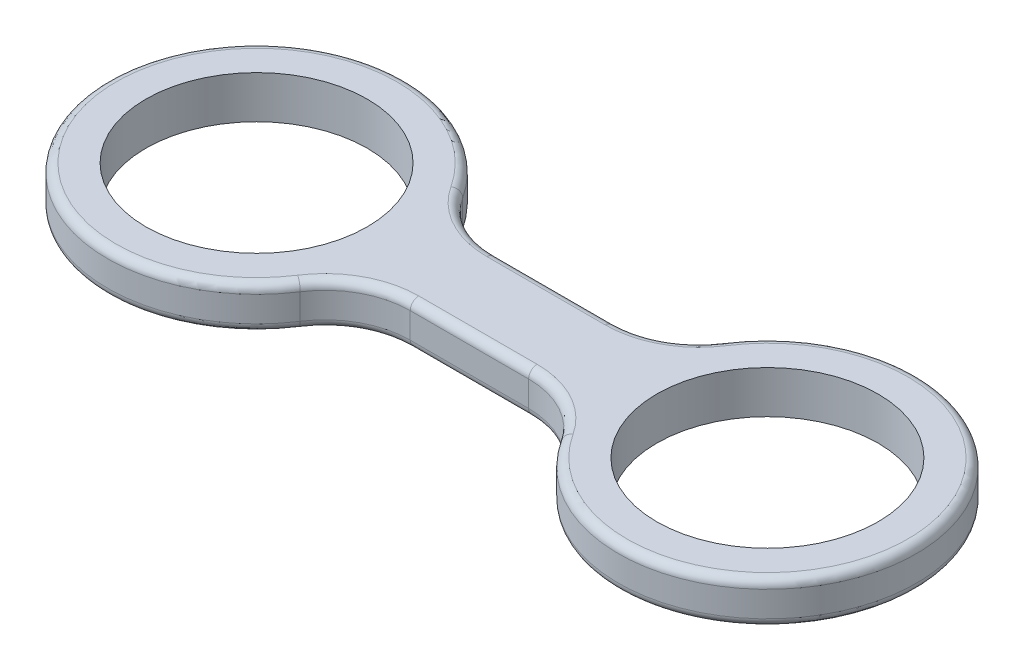
ISO-10303-21;
HEADER;
FILE_DESCRIPTION(('STEP AP214'),'2;1');
FILE_NAME('part.step','',(''),(''),'','','');
FILE_SCHEMA(('AUTOMOTIVE_DESIGN { 1 0 10303 214 1 1 1 1 }'));
ENDSEC;
DATA;
#1=APPLICATION_CONTEXT('core data for automotive mechanical design processes');
#2=APPLICATION_PROTOCOL_DEFINITION('international standard','automotive_design',2000,#1);
#3=PRODUCT_CONTEXT('',#1,'mechanical');
#4=PRODUCT('Part','Part','',(#3));
#5=PRODUCT_RELATED_PRODUCT_CATEGORY('part','',(#4));
#6=PRODUCT_DEFINITION_FORMATION('','',#4);
#7=PRODUCT_DEFINITION_CONTEXT('part definition',#1,'design');
#8=PRODUCT_DEFINITION('design','',#6,#7);
#9=PRODUCT_DEFINITION_SHAPE('','',#8);
#10=(LENGTH_UNIT() NAMED_UNIT(*) SI_UNIT(.MILLI.,.METRE.));
#11=(NAMED_UNIT(*) PLANE_ANGLE_UNIT() SI_UNIT($,.RADIAN.));
#12=(NAMED_UNIT(*) SI_UNIT($,.STERADIAN.) SOLID_ANGLE_UNIT());
#13=UNCERTAINTY_MEASURE_WITH_UNIT(LENGTH_MEASURE(1.E-05),#10,'distance_accuracy_value','');
#14=(GEOMETRIC_REPRESENTATION_CONTEXT(3) GLOBAL_UNCERTAINTY_ASSIGNED_CONTEXT((#13)) GLOBAL_UNIT_ASSIGNED_CONTEXT((#10,
#11,#12)) REPRESENTATION_CONTEXT('',''));
#15=CARTESIAN_POINT('',(0.,0.,0.));
#16=DIRECTION('',(0.,0.,1.));
#17=DIRECTION('',(1.,0.,0.));
#18=AXIS2_PLACEMENT_3D('',#15,#16,#17);
#19=CARTESIAN_POINT('',(0.,5.,0.));
#20=DIRECTION('',(0.,1.,0.));
#21=DIRECTION('',(0.,0.,1.));
#22=AXIS2_PLACEMENT_3D('',#19,#20,#21);
#23=PLANE('',#22);
#24=DIRECTION('',(-1.,0.,0.));
#25=VECTOR('',#24,1.);
#26=CARTESIAN_POINT('',(23.0488611432322,5.,-4.));
#27=LINE('',#26,#25);
#28=CARTESIAN_POINT('',(36.9511388567678,5.,-4.));
#29=VERTEX_POINT('',#28);
#30=CARTESIAN_POINT('',(23.0488611432322,5.,-4.));
#31=VERTEX_POINT('',#30);
#32=EDGE_CURVE('E61',#29,#31,#27,.T.);
#33=ORIENTED_EDGE('',*,*,#32,.T.);
#34=CARTESIAN_POINT('',(23.0488611432322,5.,-15.));
#35=DIRECTION('',(0.,1.,0.));
#36=DIRECTION('',(0.,0.,1.));
#37=AXIS2_PLACEMENT_3D('',#34,#35,#36);
#38=CIRCLE('',#37,11.);
#39=CARTESIAN_POINT('',(13.8293166859393,5.,-9.));
#40=VERTEX_POINT('',#39);
#41=EDGE_CURVE('E275',#31,#40,#38,.F.);
#42=ORIENTED_EDGE('',*,*,#41,.T.);
#43=CARTESIAN_POINT('',(0.,5.,0.));
#44=DIRECTION('',(0.,1.,0.));
#45=DIRECTION('',(0.,0.,1.));
#46=AXIS2_PLACEMENT_3D('',#43,#44,#45);
#47=CIRCLE('',#46,16.5);
#48=CARTESIAN_POINT('',(13.8293166859393,5.,9.));
#49=VERTEX_POINT('',#48);
#50=EDGE_CURVE('E256',#40,#49,#47,.T.);
#51=ORIENTED_EDGE('',*,*,#50,.T.);
#52=CARTESIAN_POINT('',(23.0488611432322,5.,15.));
#53=DIRECTION('',(0.,1.,0.));
#54=DIRECTION('',(0.,0.,1.));
#55=AXIS2_PLACEMENT_3D('',#52,#53,#54);
#56=CIRCLE('',#55,11.);
#57=CARTESIAN_POINT('',(23.0488611432322,5.,4.));
#58=VERTEX_POINT('',#57);
#59=EDGE_CURVE('E259',#49,#58,#56,.F.);
#60=ORIENTED_EDGE('',*,*,#59,.T.);
#61=DIRECTION('',(1.,0.,0.));
#62=VECTOR('',#61,1.);
#63=CARTESIAN_POINT('',(36.9511388567678,5.,4.));
#64=LINE('',#63,#62);
#65=CARTESIAN_POINT('',(36.9511388567678,5.,4.));
#66=VERTEX_POINT('',#65);
#67=EDGE_CURVE('E262',#58,#66,#64,.T.);
#68=ORIENTED_EDGE('',*,*,#67,.T.);
#69=CARTESIAN_POINT('',(36.9511388567678,5.,15.));
#70=DIRECTION('',(0.,1.,0.));
#71=DIRECTION('',(0.,0.,1.));
#72=AXIS2_PLACEMENT_3D('',#69,#70,#71);
#73=CIRCLE('',#72,11.);
#74=CARTESIAN_POINT('',(46.1706833140607,5.,9.));
#75=VERTEX_POINT('',#74);
#76=EDGE_CURVE('E265',#66,#75,#73,.F.);
#77=ORIENTED_EDGE('',*,*,#76,.T.);
#78=CARTESIAN_POINT('',(60.,5.,0.));
#79=DIRECTION('',(0.,1.,0.));
#80=DIRECTION('',(0.,0.,1.));
#81=AXIS2_PLACEMENT_3D('',#78,#79,#80);
#82=CIRCLE('',#81,16.5);
#83=CARTESIAN_POINT('',(46.1706833140607,5.,-9.));
#84=VERTEX_POINT('',#83);
#85=EDGE_CURVE('E268',#75,#84,#82,.T.);
#86=ORIENTED_EDGE('',*,*,#85,.T.);
#87=CARTESIAN_POINT('',(36.9511388567678,5.,-15.));
#88=DIRECTION('',(0.,1.,0.));
#89=DIRECTION('',(0.,0.,1.));
#90=AXIS2_PLACEMENT_3D('',#87,#88,#89);
#91=CIRCLE('',#90,11.);
#92=EDGE_CURVE('E66',#84,#29,#91,.F.);
#93=ORIENTED_EDGE('',*,*,#92,.T.);
#94=EDGE_LOOP('',(#33,#42,#51,#60,#68,#77,#86,#93));
#95=FACE_BOUND('',#94,.T.);
#96=CARTESIAN_POINT('',(0.,5.,0.));
#97=DIRECTION('',(0.,1.,0.));
#98=DIRECTION('',(0.,0.,1.));
#99=AXIS2_PLACEMENT_3D('',#96,#97,#98);
#100=CIRCLE('',#99,13.);
#101=CARTESIAN_POINT('',(0.,5.,13.));
#102=VERTEX_POINT('',#101);
#103=EDGE_CURVE('E708',#102,#102,#100,.T.);
#104=ORIENTED_EDGE('',*,*,#103,.F.);
#105=EDGE_LOOP('',(#104));
#106=FACE_BOUND('',#105,.T.);
#107=CARTESIAN_POINT('',(60.,5.,0.));
#108=DIRECTION('',(0.,1.,0.));
#109=DIRECTION('',(0.,0.,1.));
#110=AXIS2_PLACEMENT_3D('',#107,#108,#109);
#111=CIRCLE('',#110,13.);
#112=CARTESIAN_POINT('',(60.,5.,13.));
#113=VERTEX_POINT('',#112);
#114=EDGE_CURVE('E713',#113,#113,#111,.T.);
#115=ORIENTED_EDGE('',*,*,#114,.F.);
#116=EDGE_LOOP('',(#115));
#117=FACE_BOUND('',#116,.T.);
#118=ADVANCED_FACE('F43',(#95,#106,#117),#23,.T.);
#119=CARTESIAN_POINT('',(0.,0.,0.));
#120=DIRECTION('',(0.,1.,0.));
#121=DIRECTION('',(0.,0.,1.));
#122=AXIS2_PLACEMENT_3D('',#119,#120,#121);
#123=PLANE('',#122);
#124=CARTESIAN_POINT('',(60.,0.,0.));
#125=DIRECTION('',(0.,1.,0.));
#126=DIRECTION('',(0.,0.,1.));
#127=AXIS2_PLACEMENT_3D('',#124,#125,#126);
#128=CIRCLE('',#127,16.5);
#129=CARTESIAN_POINT('',(46.1706833140607,0.,-9.));
#130=VERTEX_POINT('',#129);
#131=CARTESIAN_POINT('',(46.1706833140607,0.,9.));
#132=VERTEX_POINT('',#131);
#133=EDGE_CURVE('E163',#130,#132,#128,.F.);
#134=ORIENTED_EDGE('',*,*,#133,.T.);
#135=CARTESIAN_POINT('',(36.9511388567678,0.,15.));
#136=DIRECTION('',(0.,1.,0.));
#137=DIRECTION('',(0.,0.,1.));
#138=AXIS2_PLACEMENT_3D('',#135,#136,#137);
#139=CIRCLE('',#138,11.);
#140=CARTESIAN_POINT('',(36.9511388567678,0.,4.));
#141=VERTEX_POINT('',#140);
#142=EDGE_CURVE('E210',#132,#141,#139,.T.);
#143=ORIENTED_EDGE('',*,*,#142,.T.);
#144=DIRECTION('',(1.,0.,0.));
#145=VECTOR('',#144,1.);
#146=CARTESIAN_POINT('',(0.,0.,4.));
#147=LINE('',#146,#145);
#148=CARTESIAN_POINT('',(23.0488611432322,0.,4.));
#149=VERTEX_POINT('',#148);
#150=EDGE_CURVE('E207',#141,#149,#147,.F.);
#151=ORIENTED_EDGE('',*,*,#150,.T.);
#152=CARTESIAN_POINT('',(23.0488611432322,0.,15.));
#153=DIRECTION('',(0.,1.,0.));
#154=DIRECTION('',(0.,0.,1.));
#155=AXIS2_PLACEMENT_3D('',#152,#153,#154);
#156=CIRCLE('',#155,11.);
#157=CARTESIAN_POINT('',(13.8293166859393,0.,9.));
#158=VERTEX_POINT('',#157);
#159=EDGE_CURVE('E204',#149,#158,#156,.T.);
#160=ORIENTED_EDGE('',*,*,#159,.T.);
#161=CARTESIAN_POINT('',(0.,0.,0.));
#162=DIRECTION('',(0.,1.,0.));
#163=DIRECTION('',(0.,0.,1.));
#164=AXIS2_PLACEMENT_3D('',#161,#162,#163);
#165=CIRCLE('',#164,16.5);
#166=CARTESIAN_POINT('',(13.8293166859393,0.,-9.));
#167=VERTEX_POINT('',#166);
#168=EDGE_CURVE('E201',#158,#167,#165,.F.);
#169=ORIENTED_EDGE('',*,*,#168,.T.);
#170=CARTESIAN_POINT('',(23.0488611432322,0.,-15.));
#171=DIRECTION('',(0.,1.,0.));
#172=DIRECTION('',(0.,0.,1.));
#173=AXIS2_PLACEMENT_3D('',#170,#171,#172);
#174=CIRCLE('',#173,11.);
#175=CARTESIAN_POINT('',(23.0488611432322,0.,-4.));
#176=VERTEX_POINT('',#175);
#177=EDGE_CURVE('E198',#167,#176,#174,.T.);
#178=ORIENTED_EDGE('',*,*,#177,.T.);
#179=DIRECTION('',(-1.,0.,0.));
#180=VECTOR('',#179,1.);
#181=CARTESIAN_POINT('',(0.,0.,-4.));
#182=LINE('',#181,#180);
#183=CARTESIAN_POINT('',(36.9511388567678,0.,-4.));
#184=VERTEX_POINT('',#183);
#185=EDGE_CURVE('E166',#176,#184,#182,.F.);
#186=ORIENTED_EDGE('',*,*,#185,.T.);
#187=CARTESIAN_POINT('',(36.9511388567678,0.,-15.));
#188=DIRECTION('',(0.,1.,0.));
#189=DIRECTION('',(0.,0.,1.));
#190=AXIS2_PLACEMENT_3D('',#187,#188,#189);
#191=CIRCLE('',#190,11.);
#192=EDGE_CURVE('E157',#184,#130,#191,.T.);
#193=ORIENTED_EDGE('',*,*,#192,.T.);
#194=EDGE_LOOP('',(#134,#143,#151,#160,#169,#178,#186,#193));
#195=FACE_BOUND('',#194,.T.);
#196=CARTESIAN_POINT('',(0.,0.,0.));
#197=DIRECTION('',(0.,1.,0.));
#198=DIRECTION('',(0.,0.,1.));
#199=AXIS2_PLACEMENT_3D('',#196,#197,#198);
#200=CIRCLE('',#199,13.);
#201=CARTESIAN_POINT('',(0.,0.,13.));
#202=VERTEX_POINT('',#201);
#203=EDGE_CURVE('E711',#202,#202,#200,.T.);
#204=ORIENTED_EDGE('',*,*,#203,.T.);
#205=EDGE_LOOP('',(#204));
#206=FACE_BOUND('',#205,.T.);
#207=CARTESIAN_POINT('',(60.,0.,0.));
#208=DIRECTION('',(0.,1.,0.));
#209=DIRECTION('',(0.,0.,1.));
#210=AXIS2_PLACEMENT_3D('',#207,#208,#209);
#211=CIRCLE('',#210,13.);
#212=CARTESIAN_POINT('',(60.,0.,13.));
#213=VERTEX_POINT('',#212);
#214=EDGE_CURVE('E302',#213,#213,#211,.T.);
#215=ORIENTED_EDGE('',*,*,#214,.T.);
#216=EDGE_LOOP('',(#215));
#217=FACE_BOUND('',#216,.T.);
#218=ADVANCED_FACE('F159',(#195,#206,#217),#123,.F.);
#219=CARTESIAN_POINT('',(0.,5.,0.));
#220=DIRECTION('',(0.,-1.,0.));
#221=DIRECTION('',(0.,0.,-1.));
#222=AXIS2_PLACEMENT_3D('',#219,#220,#221);
#223=CYLINDRICAL_SURFACE('',#222,17.5);
#224=DIRECTION('',(0.,-1.,0.));
#225=VECTOR('',#224,1.);
#226=CARTESIAN_POINT('',(14.6674570911478,5.,-9.54545454545454));
#227=LINE('',#226,#225);
#228=CARTESIAN_POINT('',(14.6674570911478,4.,-9.54545454545454));
#229=VERTEX_POINT('',#228);
#230=CARTESIAN_POINT('',(14.6674570911478,1.,-9.54545454545454));
#231=VERTEX_POINT('',#230);
#232=EDGE_CURVE('E359',#229,#231,#227,.T.);
#233=ORIENTED_EDGE('',*,*,#232,.T.);
#234=CARTESIAN_POINT('',(0.,1.,0.));
#235=DIRECTION('',(0.,1.,0.));
#236=DIRECTION('',(0.,0.,1.));
#237=AXIS2_PLACEMENT_3D('',#234,#235,#236);
#238=CIRCLE('',#237,17.5);
#239=CARTESIAN_POINT('',(14.6674570911478,1.,9.54545454545454));
#240=VERTEX_POINT('',#239);
#241=EDGE_CURVE('E235',#231,#240,#238,.T.);
#242=ORIENTED_EDGE('',*,*,#241,.T.);
#243=DIRECTION('',(0.,-1.,0.));
#244=VECTOR('',#243,1.);
#245=CARTESIAN_POINT('',(14.6674570911478,5.,9.54545454545454));
#246=LINE('',#245,#244);
#247=CARTESIAN_POINT('',(14.6674570911478,4.,9.54545454545454));
#248=VERTEX_POINT('',#247);
#249=EDGE_CURVE('E366',#240,#248,#246,.F.);
#250=ORIENTED_EDGE('',*,*,#249,.T.);
#251=CARTESIAN_POINT('',(0.,4.,0.));
#252=DIRECTION('',(0.,1.,0.));
#253=DIRECTION('',(0.,0.,1.));
#254=AXIS2_PLACEMENT_3D('',#251,#252,#253);
#255=CIRCLE('',#254,17.5);
#256=EDGE_CURVE('E232',#248,#229,#255,.F.);
#257=ORIENTED_EDGE('',*,*,#256,.T.);
#258=EDGE_LOOP('',(#233,#242,#250,#257));
#259=FACE_BOUND('',#258,.T.);
#260=ADVANCED_FACE('F410',(#259),#223,.T.);
#261=CARTESIAN_POINT('',(16.7705098312484,5.,5.));
#262=DIRECTION('',(0.,0.,-1.));
#263=DIRECTION('',(-1.,0.,0.));
#264=AXIS2_PLACEMENT_3D('',#261,#262,#263);
#265=PLANE('',#264);
#266=DIRECTION('',(0.,1.,0.));
#267=VECTOR('',#266,1.);
#268=CARTESIAN_POINT('',(23.0488611432322,0.,5.));
#269=LINE('',#268,#267);
#270=CARTESIAN_POINT('',(23.0488611432322,4.,5.));
#271=VERTEX_POINT('',#270);
#272=CARTESIAN_POINT('',(23.0488611432322,1.,5.));
#273=VERTEX_POINT('',#272);
#274=EDGE_CURVE('E360',#271,#273,#269,.F.);
#275=ORIENTED_EDGE('',*,*,#274,.T.);
#276=DIRECTION('',(1.,0.,0.));
#277=VECTOR('',#276,1.);
#278=CARTESIAN_POINT('',(16.7705098312484,1.,5.));
#279=LINE('',#278,#277);
#280=CARTESIAN_POINT('',(36.9511388567678,1.,5.));
#281=VERTEX_POINT('',#280);
#282=EDGE_CURVE('E223',#273,#281,#279,.T.);
#283=ORIENTED_EDGE('',*,*,#282,.T.);
#284=DIRECTION('',(0.,1.,0.));
#285=VECTOR('',#284,1.);
#286=CARTESIAN_POINT('',(36.9511388567678,5.,5.));
#287=LINE('',#286,#285);
#288=CARTESIAN_POINT('',(36.9511388567678,4.,5.));
#289=VERTEX_POINT('',#288);
#290=EDGE_CURVE('E349',#281,#289,#287,.T.);
#291=ORIENTED_EDGE('',*,*,#290,.T.);
#292=DIRECTION('',(1.,0.,0.));
#293=VECTOR('',#292,1.);
#294=CARTESIAN_POINT('',(23.0488611432322,4.,5.));
#295=LINE('',#294,#293);
#296=EDGE_CURVE('E220',#289,#271,#295,.F.);
#297=ORIENTED_EDGE('',*,*,#296,.T.);
#298=EDGE_LOOP('',(#275,#283,#291,#297));
#299=FACE_BOUND('',#298,.T.);
#300=ADVANCED_FACE('F355',(#299),#265,.F.);
#301=CARTESIAN_POINT('',(60.,5.,0.));
#302=DIRECTION('',(0.,-1.,0.));
#303=DIRECTION('',(0.,0.,-1.));
#304=AXIS2_PLACEMENT_3D('',#301,#302,#303);
#305=CYLINDRICAL_SURFACE('',#304,17.5);
#306=DIRECTION('',(0.,-1.,0.));
#307=VECTOR('',#306,1.);
#308=CARTESIAN_POINT('',(45.3325429088522,5.,-9.54545454545455));
#309=LINE('',#308,#307);
#310=CARTESIAN_POINT('',(45.3325429088522,1.,-9.54545454545455));
#311=VERTEX_POINT('',#310);
#312=CARTESIAN_POINT('',(45.3325429088522,4.,-9.54545454545455));
#313=VERTEX_POINT('',#312);
#314=EDGE_CURVE('E718',#311,#313,#309,.F.);
#315=ORIENTED_EDGE('',*,*,#314,.T.);
#316=CARTESIAN_POINT('',(60.,4.,0.));
#317=DIRECTION('',(0.,1.,0.));
#318=DIRECTION('',(0.,0.,1.));
#319=AXIS2_PLACEMENT_3D('',#316,#317,#318);
#320=CIRCLE('',#319,17.5);
#321=CARTESIAN_POINT('',(45.3325429088522,4.,9.54545454545455));
#322=VERTEX_POINT('',#321);
#323=EDGE_CURVE('E11',#313,#322,#320,.F.);
#324=ORIENTED_EDGE('',*,*,#323,.T.);
#325=DIRECTION('',(0.,-1.,0.));
#326=VECTOR('',#325,1.);
#327=CARTESIAN_POINT('',(45.3325429088522,5.,9.54545454545455));
#328=LINE('',#327,#326);
#329=CARTESIAN_POINT('',(45.3325429088522,1.,9.54545454545455));
#330=VERTEX_POINT('',#329);
#331=EDGE_CURVE('E352',#322,#330,#328,.T.);
#332=ORIENTED_EDGE('',*,*,#331,.T.);
#333=CARTESIAN_POINT('',(60.,1.,0.));
#334=DIRECTION('',(0.,1.,0.));
#335=DIRECTION('',(0.,0.,1.));
#336=AXIS2_PLACEMENT_3D('',#333,#334,#335);
#337=CIRCLE('',#336,17.5);
#338=EDGE_CURVE('E53',#330,#311,#337,.T.);
#339=ORIENTED_EDGE('',*,*,#338,.T.);
#340=EDGE_LOOP('',(#315,#324,#332,#339));
#341=FACE_BOUND('',#340,.T.);
#342=ADVANCED_FACE('F419',(#341),#305,.T.);
#343=CARTESIAN_POINT('',(16.7705098312484,5.,-5.));
#344=DIRECTION('',(0.,0.,1.));
#345=DIRECTION('',(1.,0.,0.));
#346=AXIS2_PLACEMENT_3D('',#343,#344,#345);
#347=PLANE('',#346);
#348=DIRECTION('',(0.,1.,0.));
#349=VECTOR('',#348,1.);
#350=CARTESIAN_POINT('',(36.9511388567678,0.,-5.));
#351=LINE('',#350,#349);
#352=CARTESIAN_POINT('',(36.9511388567678,4.,-5.));
#353=VERTEX_POINT('',#352);
#354=CARTESIAN_POINT('',(36.9511388567678,1.,-5.));
#355=VERTEX_POINT('',#354);
#356=EDGE_CURVE('E187',#353,#355,#351,.F.);
#357=ORIENTED_EDGE('',*,*,#356,.T.);
#358=DIRECTION('',(-1.,0.,0.));
#359=VECTOR('',#358,1.);
#360=CARTESIAN_POINT('',(16.7705098312484,1.,-5.));
#361=LINE('',#360,#359);
#362=CARTESIAN_POINT('',(23.0488611432322,1.,-5.));
#363=VERTEX_POINT('',#362);
#364=EDGE_CURVE('E248',#355,#363,#361,.T.);
#365=ORIENTED_EDGE('',*,*,#364,.T.);
#366=DIRECTION('',(0.,1.,0.));
#367=VECTOR('',#366,1.);
#368=CARTESIAN_POINT('',(23.0488611432322,5.,-5.));
#369=LINE('',#368,#367);
#370=CARTESIAN_POINT('',(23.0488611432322,4.,-5.));
#371=VERTEX_POINT('',#370);
#372=EDGE_CURVE('E192',#363,#371,#369,.T.);
#373=ORIENTED_EDGE('',*,*,#372,.T.);
#374=DIRECTION('',(-1.,0.,0.));
#375=VECTOR('',#374,1.);
#376=CARTESIAN_POINT('',(36.9511388567678,4.,-5.));
#377=LINE('',#376,#375);
#378=EDGE_CURVE('E245',#371,#353,#377,.F.);
#379=ORIENTED_EDGE('',*,*,#378,.T.);
#380=EDGE_LOOP('',(#357,#365,#373,#379));
#381=FACE_BOUND('',#380,.T.);
#382=ADVANCED_FACE('F378',(#381),#347,.F.);
#383=CARTESIAN_POINT('',(0.,5.,0.));
#384=DIRECTION('',(0.,-1.,0.));
#385=DIRECTION('',(0.,0.,-1.));
#386=AXIS2_PLACEMENT_3D('',#383,#384,#385);
#387=CYLINDRICAL_SURFACE('',#386,13.);
#388=ORIENTED_EDGE('',*,*,#103,.T.);
#389=EDGE_LOOP('',(#388));
#390=FACE_BOUND('',#389,.T.);
#391=ORIENTED_EDGE('',*,*,#203,.F.);
#392=EDGE_LOOP('',(#391));
#393=FACE_BOUND('',#392,.T.);
#394=ADVANCED_FACE('F414',(#390,#393),#387,.F.);
#395=CARTESIAN_POINT('',(60.,5.,0.));
#396=DIRECTION('',(0.,-1.,0.));
#397=DIRECTION('',(0.,0.,-1.));
#398=AXIS2_PLACEMENT_3D('',#395,#396,#397);
#399=CYLINDRICAL_SURFACE('',#398,13.);
#400=ORIENTED_EDGE('',*,*,#114,.T.);
#401=EDGE_LOOP('',(#400));
#402=FACE_BOUND('',#401,.T.);
#403=ORIENTED_EDGE('',*,*,#214,.F.);
#404=EDGE_LOOP('',(#403));
#405=FACE_BOUND('',#404,.T.);
#406=ADVANCED_FACE('F431',(#402,#405),#399,.F.);
#407=CARTESIAN_POINT('',(36.9511388567678,5.,15.));
#408=DIRECTION('',(0.,-1.,0.));
#409=DIRECTION('',(0.,0.,-1.));
#410=AXIS2_PLACEMENT_3D('',#407,#408,#409);
#411=CYLINDRICAL_SURFACE('',#410,10.);
#412=ORIENTED_EDGE('',*,*,#290,.F.);
#413=CARTESIAN_POINT('',(36.9511388567678,1.,15.));
#414=DIRECTION('',(0.,1.,0.));
#415=DIRECTION('',(0.,0.,1.));
#416=AXIS2_PLACEMENT_3D('',#413,#414,#415);
#417=CIRCLE('',#416,10.);
#418=EDGE_CURVE('E216',#281,#330,#417,.F.);
#419=ORIENTED_EDGE('',*,*,#418,.T.);
#420=ORIENTED_EDGE('',*,*,#331,.F.);
#421=CARTESIAN_POINT('',(36.9511388567678,4.,15.));
#422=DIRECTION('',(0.,1.,0.));
#423=DIRECTION('',(0.,0.,1.));
#424=AXIS2_PLACEMENT_3D('',#421,#422,#423);
#425=CIRCLE('',#424,10.);
#426=EDGE_CURVE('E213',#322,#289,#425,.T.);
#427=ORIENTED_EDGE('',*,*,#426,.T.);
#428=EDGE_LOOP('',(#412,#419,#420,#427));
#429=FACE_BOUND('',#428,.T.);
#430=ADVANCED_FACE('F348',(#429),#411,.F.);
#431=CARTESIAN_POINT('',(23.0488611432322,5.,15.));
#432=DIRECTION('',(0.,-1.,0.));
#433=DIRECTION('',(0.,0.,-1.));
#434=AXIS2_PLACEMENT_3D('',#431,#432,#433);
#435=CYLINDRICAL_SURFACE('',#434,10.);
#436=ORIENTED_EDGE('',*,*,#249,.F.);
#437=CARTESIAN_POINT('',(23.0488611432322,1.,15.));
#438=DIRECTION('',(0.,1.,0.));
#439=DIRECTION('',(0.,0.,1.));
#440=AXIS2_PLACEMENT_3D('',#437,#438,#439);
#441=CIRCLE('',#440,10.);
#442=EDGE_CURVE('E229',#240,#273,#441,.F.);
#443=ORIENTED_EDGE('',*,*,#442,.T.);
#444=ORIENTED_EDGE('',*,*,#274,.F.);
#445=CARTESIAN_POINT('',(23.0488611432322,4.,15.));
#446=DIRECTION('',(0.,1.,0.));
#447=DIRECTION('',(0.,0.,1.));
#448=AXIS2_PLACEMENT_3D('',#445,#446,#447);
#449=CIRCLE('',#448,10.);
#450=EDGE_CURVE('E226',#271,#248,#449,.T.);
#451=ORIENTED_EDGE('',*,*,#450,.T.);
#452=EDGE_LOOP('',(#436,#443,#444,#451));
#453=FACE_BOUND('',#452,.T.);
#454=ADVANCED_FACE('F430',(#453),#435,.F.);
#455=CARTESIAN_POINT('',(36.9511388567678,5.,-15.));
#456=DIRECTION('',(0.,-1.,0.));
#457=DIRECTION('',(0.,0.,-1.));
#458=AXIS2_PLACEMENT_3D('',#455,#456,#457);
#459=CYLINDRICAL_SURFACE('',#458,10.);
#460=ORIENTED_EDGE('',*,*,#314,.F.);
#461=CARTESIAN_POINT('',(36.9511388567678,1.,-15.));
#462=DIRECTION('',(0.,1.,0.));
#463=DIRECTION('',(0.,0.,1.));
#464=AXIS2_PLACEMENT_3D('',#461,#462,#463);
#465=CIRCLE('',#464,10.);
#466=EDGE_CURVE('E176',#311,#355,#465,.F.);
#467=ORIENTED_EDGE('',*,*,#466,.T.);
#468=ORIENTED_EDGE('',*,*,#356,.F.);
#469=CARTESIAN_POINT('',(36.9511388567678,4.,-15.));
#470=DIRECTION('',(0.,1.,0.));
#471=DIRECTION('',(0.,0.,1.));
#472=AXIS2_PLACEMENT_3D('',#469,#470,#471);
#473=CIRCLE('',#472,10.);
#474=EDGE_CURVE('E251',#353,#313,#473,.T.);
#475=ORIENTED_EDGE('',*,*,#474,.T.);
#476=EDGE_LOOP('',(#460,#467,#468,#475));
#477=FACE_BOUND('',#476,.T.);
#478=ADVANCED_FACE('F434',(#477),#459,.F.);
#479=CARTESIAN_POINT('',(23.0488611432322,5.,-15.));
#480=DIRECTION('',(0.,-1.,0.));
#481=DIRECTION('',(0.,0.,-1.));
#482=AXIS2_PLACEMENT_3D('',#479,#480,#481);
#483=CYLINDRICAL_SURFACE('',#482,10.);
#484=ORIENTED_EDGE('',*,*,#372,.F.);
#485=CARTESIAN_POINT('',(23.0488611432322,1.,-15.));
#486=DIRECTION('',(0.,1.,0.));
#487=DIRECTION('',(0.,0.,1.));
#488=AXIS2_PLACEMENT_3D('',#485,#486,#487);
#489=CIRCLE('',#488,10.);
#490=EDGE_CURVE('E242',#363,#231,#489,.F.);
#491=ORIENTED_EDGE('',*,*,#490,.T.);
#492=ORIENTED_EDGE('',*,*,#232,.F.);
#493=CARTESIAN_POINT('',(23.0488611432322,4.,-15.));
#494=DIRECTION('',(0.,1.,0.));
#495=DIRECTION('',(0.,0.,1.));
#496=AXIS2_PLACEMENT_3D('',#493,#494,#495);
#497=CIRCLE('',#496,10.);
#498=EDGE_CURVE('E238',#229,#371,#497,.T.);
#499=ORIENTED_EDGE('',*,*,#498,.T.);
#500=EDGE_LOOP('',(#484,#491,#492,#499));
#501=FACE_BOUND('',#500,.T.);
#502=ADVANCED_FACE('F384',(#501),#483,.F.);
#503=CARTESIAN_POINT('',(23.0488611432322,1.,-15.));
#504=DIRECTION('',(0.,1.,0.));
#505=DIRECTION('',(0.,0.,1.));
#506=AXIS2_PLACEMENT_3D('',#503,#504,#505);
#507=TOROIDAL_SURFACE('',#506,11.,1.);
#508=CARTESIAN_POINT('',(13.8293166859393,1.,-9.));
#509=DIRECTION('',(-0.545454545454545,0.,-0.838140405208444));
#510=DIRECTION('',(-0.838140405208445,0.,0.545454545454545));
#511=AXIS2_PLACEMENT_3D('',#508,#509,#510);
#512=CIRCLE('',#511,1.);
#513=EDGE_CURVE('E294',#231,#167,#512,.T.);
#514=ORIENTED_EDGE('',*,*,#513,.F.);
#515=ORIENTED_EDGE('',*,*,#490,.F.);
#516=CARTESIAN_POINT('',(23.0488611432322,1.,-4.));
#517=DIRECTION('',(1.,0.,0.));
#518=DIRECTION('',(0.,0.,-1.));
#519=AXIS2_PLACEMENT_3D('',#516,#517,#518);
#520=CIRCLE('',#519,1.);
#521=EDGE_CURVE('E298',#176,#363,#520,.T.);
#522=ORIENTED_EDGE('',*,*,#521,.F.);
#523=ORIENTED_EDGE('',*,*,#177,.F.);
#524=EDGE_LOOP('',(#514,#515,#522,#523));
#525=FACE_BOUND('',#524,.T.);
#526=ADVANCED_FACE('F390',(#525),#507,.T.);
#527=CARTESIAN_POINT('',(16.7705098312484,1.,-4.));
#528=DIRECTION('',(-1.,0.,0.));
#529=DIRECTION('',(0.,0.,1.));
#530=AXIS2_PLACEMENT_3D('',#527,#528,#529);
#531=CYLINDRICAL_SURFACE('',#530,1.);
#532=ORIENTED_EDGE('',*,*,#521,.T.);
#533=ORIENTED_EDGE('',*,*,#364,.F.);
#534=CARTESIAN_POINT('',(36.9511388567678,1.,-4.));
#535=DIRECTION('',(1.,0.,0.));
#536=DIRECTION('',(0.,0.,-1.));
#537=AXIS2_PLACEMENT_3D('',#534,#535,#536);
#538=CIRCLE('',#537,1.);
#539=EDGE_CURVE('E291',#184,#355,#538,.T.);
#540=ORIENTED_EDGE('',*,*,#539,.F.);
#541=ORIENTED_EDGE('',*,*,#185,.F.);
#542=EDGE_LOOP('',(#532,#533,#540,#541));
#543=FACE_BOUND('',#542,.T.);
#544=ADVANCED_FACE('F394',(#543),#531,.T.);
#545=CARTESIAN_POINT('',(0.,1.,0.));
#546=DIRECTION('',(0.,1.,0.));
#547=DIRECTION('',(0.,0.,1.));
#548=AXIS2_PLACEMENT_3D('',#545,#546,#547);
#549=TOROIDAL_SURFACE('',#548,16.5,1.);
#550=ORIENTED_EDGE('',*,*,#513,.T.);
#551=ORIENTED_EDGE('',*,*,#168,.F.);
#552=CARTESIAN_POINT('',(13.8293166859393,1.,9.));
#553=DIRECTION('',(0.545454545454545,0.,-0.838140405208444));
#554=DIRECTION('',(-0.838140405208445,0.,-0.545454545454545));
#555=AXIS2_PLACEMENT_3D('',#552,#553,#554);
#556=CIRCLE('',#555,1.);
#557=EDGE_CURVE('E180',#240,#158,#556,.T.);
#558=ORIENTED_EDGE('',*,*,#557,.F.);
#559=ORIENTED_EDGE('',*,*,#241,.F.);
#560=EDGE_LOOP('',(#550,#551,#558,#559));
#561=FACE_BOUND('',#560,.T.);
#562=ADVANCED_FACE('F396',(#561),#549,.T.);
#563=CARTESIAN_POINT('',(36.9511388567678,1.,-15.));
#564=DIRECTION('',(0.,1.,0.));
#565=DIRECTION('',(0.,0.,1.));
#566=AXIS2_PLACEMENT_3D('',#563,#564,#565);
#567=TOROIDAL_SURFACE('',#566,11.,1.);
#568=ORIENTED_EDGE('',*,*,#539,.T.);
#569=ORIENTED_EDGE('',*,*,#466,.F.);
#570=CARTESIAN_POINT('',(46.1706833140607,1.,-9.));
#571=DIRECTION('',(0.545454545454545,0.,-0.838140405208444));
#572=DIRECTION('',(-0.838140405208445,0.,-0.545454545454545));
#573=AXIS2_PLACEMENT_3D('',#570,#571,#572);
#574=CIRCLE('',#573,1.);
#575=EDGE_CURVE('E174',#130,#311,#574,.T.);
#576=ORIENTED_EDGE('',*,*,#575,.F.);
#577=ORIENTED_EDGE('',*,*,#192,.F.);
#578=EDGE_LOOP('',(#568,#569,#576,#577));
#579=FACE_BOUND('',#578,.T.);
#580=ADVANCED_FACE('F175',(#579),#567,.T.);
#581=CARTESIAN_POINT('',(23.0488611432322,1.,15.));
#582=DIRECTION('',(0.,1.,0.));
#583=DIRECTION('',(0.,0.,1.));
#584=AXIS2_PLACEMENT_3D('',#581,#582,#583);
#585=TOROIDAL_SURFACE('',#584,11.,1.);
#586=ORIENTED_EDGE('',*,*,#557,.T.);
#587=ORIENTED_EDGE('',*,*,#159,.F.);
#588=CARTESIAN_POINT('',(23.0488611432322,1.,4.));
#589=DIRECTION('',(1.,0.,0.));
#590=DIRECTION('',(0.,0.,-1.));
#591=AXIS2_PLACEMENT_3D('',#588,#589,#590);
#592=CIRCLE('',#591,1.);
#593=EDGE_CURVE('E181',#273,#149,#592,.T.);
#594=ORIENTED_EDGE('',*,*,#593,.F.);
#595=ORIENTED_EDGE('',*,*,#442,.F.);
#596=EDGE_LOOP('',(#586,#587,#594,#595));
#597=FACE_BOUND('',#596,.T.);
#598=ADVANCED_FACE('F451',(#597),#585,.T.);
#599=CARTESIAN_POINT('',(60.,1.,0.));
#600=DIRECTION('',(0.,1.,0.));
#601=DIRECTION('',(0.,0.,1.));
#602=AXIS2_PLACEMENT_3D('',#599,#600,#601);
#603=TOROIDAL_SURFACE('',#602,16.5,1.);
#604=ORIENTED_EDGE('',*,*,#575,.T.);
#605=ORIENTED_EDGE('',*,*,#338,.F.);
#606=CARTESIAN_POINT('',(46.1706833140607,1.,9.));
#607=DIRECTION('',(-0.545454545454546,0.,-0.838140405208444));
#608=DIRECTION('',(-0.838140405208444,0.,0.545454545454546));
#609=AXIS2_PLACEMENT_3D('',#606,#607,#608);
#610=CIRCLE('',#609,1.);
#611=EDGE_CURVE('E184',#132,#330,#610,.T.);
#612=ORIENTED_EDGE('',*,*,#611,.F.);
#613=ORIENTED_EDGE('',*,*,#133,.F.);
#614=EDGE_LOOP('',(#604,#605,#612,#613));
#615=FACE_BOUND('',#614,.T.);
#616=ADVANCED_FACE('F183',(#615),#603,.T.);
#617=CARTESIAN_POINT('',(16.7705098312484,1.,4.));
#618=DIRECTION('',(1.,0.,0.));
#619=DIRECTION('',(0.,0.,-1.));
#620=AXIS2_PLACEMENT_3D('',#617,#618,#619);
#621=CYLINDRICAL_SURFACE('',#620,1.);
#622=ORIENTED_EDGE('',*,*,#593,.T.);
#623=ORIENTED_EDGE('',*,*,#150,.F.);
#624=CARTESIAN_POINT('',(36.9511388567678,1.,4.));
#625=DIRECTION('',(1.,0.,0.));
#626=DIRECTION('',(0.,0.,-1.));
#627=AXIS2_PLACEMENT_3D('',#624,#625,#626);
#628=CIRCLE('',#627,1.);
#629=EDGE_CURVE('E280',#281,#141,#628,.T.);
#630=ORIENTED_EDGE('',*,*,#629,.F.);
#631=ORIENTED_EDGE('',*,*,#282,.F.);
#632=EDGE_LOOP('',(#622,#623,#630,#631));
#633=FACE_BOUND('',#632,.T.);
#634=ADVANCED_FACE('F444',(#633),#621,.T.);
#635=CARTESIAN_POINT('',(36.9511388567678,1.,15.));
#636=DIRECTION('',(0.,1.,0.));
#637=DIRECTION('',(0.,0.,1.));
#638=AXIS2_PLACEMENT_3D('',#635,#636,#637);
#639=TOROIDAL_SURFACE('',#638,11.,1.);
#640=ORIENTED_EDGE('',*,*,#611,.T.);
#641=ORIENTED_EDGE('',*,*,#418,.F.);
#642=ORIENTED_EDGE('',*,*,#629,.T.);
#643=ORIENTED_EDGE('',*,*,#142,.F.);
#644=EDGE_LOOP('',(#640,#641,#642,#643));
#645=FACE_BOUND('',#644,.T.);
#646=ADVANCED_FACE('F441',(#645),#639,.T.);
#647=CARTESIAN_POINT('',(36.9511388567678,4.,15.));
#648=DIRECTION('',(0.,1.,0.));
#649=DIRECTION('',(0.,0.,1.));
#650=AXIS2_PLACEMENT_3D('',#647,#648,#649);
#651=TOROIDAL_SURFACE('',#650,11.,1.);
#652=CARTESIAN_POINT('',(36.9511388567678,4.,4.));
#653=DIRECTION('',(-1.,0.,0.));
#654=DIRECTION('',(0.,0.,1.));
#655=AXIS2_PLACEMENT_3D('',#652,#653,#654);
#656=CIRCLE('',#655,1.);
#657=EDGE_CURVE('E324',#289,#66,#656,.T.);
#658=ORIENTED_EDGE('',*,*,#657,.F.);
#659=ORIENTED_EDGE('',*,*,#426,.F.);
#660=CARTESIAN_POINT('',(46.1706833140607,4.,9.));
#661=DIRECTION('',(0.545454545454544,0.,0.838140405208445));
#662=DIRECTION('',(0.838140405208445,0.,-0.545454545454544));
#663=AXIS2_PLACEMENT_3D('',#660,#661,#662);
#664=CIRCLE('',#663,1.);
#665=EDGE_CURVE('E47',#75,#322,#664,.T.);
#666=ORIENTED_EDGE('',*,*,#665,.F.);
#667=ORIENTED_EDGE('',*,*,#76,.F.);
#668=EDGE_LOOP('',(#658,#659,#666,#667));
#669=FACE_BOUND('',#668,.T.);
#670=ADVANCED_FACE('F45',(#669),#651,.T.);
#671=CARTESIAN_POINT('',(60.,4.,0.));
#672=DIRECTION('',(0.,1.,0.));
#673=DIRECTION('',(0.,0.,1.));
#674=AXIS2_PLACEMENT_3D('',#671,#672,#673);
#675=TOROIDAL_SURFACE('',#674,16.5,1.);
#676=ORIENTED_EDGE('',*,*,#665,.T.);
#677=ORIENTED_EDGE('',*,*,#323,.F.);
#678=CARTESIAN_POINT('',(46.1706833140607,4.,-9.));
#679=DIRECTION('',(-0.545454545454546,0.,0.838140405208444));
#680=DIRECTION('',(0.838140405208444,0.,0.545454545454546));
#681=AXIS2_PLACEMENT_3D('',#678,#679,#680);
#682=CIRCLE('',#681,1.);
#683=EDGE_CURVE('E321',#84,#313,#682,.T.);
#684=ORIENTED_EDGE('',*,*,#683,.F.);
#685=ORIENTED_EDGE('',*,*,#85,.F.);
#686=EDGE_LOOP('',(#676,#677,#684,#685));
#687=FACE_BOUND('',#686,.T.);
#688=ADVANCED_FACE('F339',(#687),#675,.T.);
#689=CARTESIAN_POINT('',(0.,4.,4.));
#690=DIRECTION('',(-1.,0.,0.));
#691=DIRECTION('',(0.,0.,1.));
#692=AXIS2_PLACEMENT_3D('',#689,#690,#691);
#693=CYLINDRICAL_SURFACE('',#692,1.);
#694=ORIENTED_EDGE('',*,*,#657,.T.);
#695=ORIENTED_EDGE('',*,*,#67,.F.);
#696=CARTESIAN_POINT('',(23.0488611432322,4.,4.));
#697=DIRECTION('',(-1.,0.,0.));
#698=DIRECTION('',(0.,0.,1.));
#699=AXIS2_PLACEMENT_3D('',#696,#697,#698);
#700=CIRCLE('',#699,1.);
#701=EDGE_CURVE('E317',#271,#58,#700,.T.);
#702=ORIENTED_EDGE('',*,*,#701,.F.);
#703=ORIENTED_EDGE('',*,*,#296,.F.);
#704=EDGE_LOOP('',(#694,#695,#702,#703));
#705=FACE_BOUND('',#704,.T.);
#706=ADVANCED_FACE('F487',(#705),#693,.T.);
#707=CARTESIAN_POINT('',(36.9511388567678,4.,-15.));
#708=DIRECTION('',(0.,1.,0.));
#709=DIRECTION('',(0.,0.,1.));
#710=AXIS2_PLACEMENT_3D('',#707,#708,#709);
#711=TOROIDAL_SURFACE('',#710,11.,1.);
#712=ORIENTED_EDGE('',*,*,#683,.T.);
#713=ORIENTED_EDGE('',*,*,#474,.F.);
#714=CARTESIAN_POINT('',(36.9511388567678,4.,-4.));
#715=DIRECTION('',(-1.,0.,0.));
#716=DIRECTION('',(0.,0.,1.));
#717=AXIS2_PLACEMENT_3D('',#714,#715,#716);
#718=CIRCLE('',#717,1.);
#719=EDGE_CURVE('E313',#29,#353,#718,.T.);
#720=ORIENTED_EDGE('',*,*,#719,.F.);
#721=ORIENTED_EDGE('',*,*,#92,.F.);
#722=EDGE_LOOP('',(#712,#713,#720,#721));
#723=FACE_BOUND('',#722,.T.);
#724=ADVANCED_FACE('F493',(#723),#711,.T.);
#725=CARTESIAN_POINT('',(23.0488611432322,4.,15.));
#726=DIRECTION('',(0.,1.,0.));
#727=DIRECTION('',(0.,0.,1.));
#728=AXIS2_PLACEMENT_3D('',#725,#726,#727);
#729=TOROIDAL_SURFACE('',#728,11.,1.);
#730=ORIENTED_EDGE('',*,*,#701,.T.);
#731=ORIENTED_EDGE('',*,*,#59,.F.);
#732=CARTESIAN_POINT('',(13.8293166859393,4.,9.));
#733=DIRECTION('',(-0.545454545454545,0.,0.838140405208444));
#734=DIRECTION('',(0.838140405208445,0.,0.545454545454545));
#735=AXIS2_PLACEMENT_3D('',#732,#733,#734);
#736=CIRCLE('',#735,1.);
#737=EDGE_CURVE('E309',#248,#49,#736,.T.);
#738=ORIENTED_EDGE('',*,*,#737,.F.);
#739=ORIENTED_EDGE('',*,*,#450,.F.);
#740=EDGE_LOOP('',(#730,#731,#738,#739));
#741=FACE_BOUND('',#740,.T.);
#742=ADVANCED_FACE('F500',(#741),#729,.T.);
#743=CARTESIAN_POINT('',(0.,4.,-4.));
#744=DIRECTION('',(1.,0.,0.));
#745=DIRECTION('',(0.,0.,-1.));
#746=AXIS2_PLACEMENT_3D('',#743,#744,#745);
#747=CYLINDRICAL_SURFACE('',#746,1.);
#748=ORIENTED_EDGE('',*,*,#719,.T.);
#749=ORIENTED_EDGE('',*,*,#378,.F.);
#750=CARTESIAN_POINT('',(23.0488611432322,4.,-4.));
#751=DIRECTION('',(-1.,0.,0.));
#752=DIRECTION('',(0.,0.,1.));
#753=AXIS2_PLACEMENT_3D('',#750,#751,#752);
#754=CIRCLE('',#753,1.);
#755=EDGE_CURVE('E306',#31,#371,#754,.T.);
#756=ORIENTED_EDGE('',*,*,#755,.F.);
#757=ORIENTED_EDGE('',*,*,#32,.F.);
#758=EDGE_LOOP('',(#748,#749,#756,#757));
#759=FACE_BOUND('',#758,.T.);
#760=ADVANCED_FACE('F508',(#759),#747,.T.);
#761=CARTESIAN_POINT('',(0.,4.,0.));
#762=DIRECTION('',(0.,1.,0.));
#763=DIRECTION('',(0.,0.,1.));
#764=AXIS2_PLACEMENT_3D('',#761,#762,#763);
#765=TOROIDAL_SURFACE('',#764,16.5,1.);
#766=ORIENTED_EDGE('',*,*,#737,.T.);
#767=ORIENTED_EDGE('',*,*,#50,.F.);
#768=CARTESIAN_POINT('',(13.8293166859393,4.,-9.));
#769=DIRECTION('',(0.545454545454545,0.,0.838140405208444));
#770=DIRECTION('',(0.838140405208445,0.,-0.545454545454545));
#771=AXIS2_PLACEMENT_3D('',#768,#769,#770);
#772=CIRCLE('',#771,1.);
#773=EDGE_CURVE('E303',#229,#40,#772,.T.);
#774=ORIENTED_EDGE('',*,*,#773,.F.);
#775=ORIENTED_EDGE('',*,*,#256,.F.);
#776=EDGE_LOOP('',(#766,#767,#774,#775));
#777=FACE_BOUND('',#776,.T.);
#778=ADVANCED_FACE('F516',(#777),#765,.T.);
#779=CARTESIAN_POINT('',(23.0488611432322,4.,-15.));
#780=DIRECTION('',(0.,1.,0.));
#781=DIRECTION('',(0.,0.,1.));
#782=AXIS2_PLACEMENT_3D('',#779,#780,#781);
#783=TOROIDAL_SURFACE('',#782,11.,1.);
#784=ORIENTED_EDGE('',*,*,#755,.T.);
#785=ORIENTED_EDGE('',*,*,#498,.F.);
#786=ORIENTED_EDGE('',*,*,#773,.T.);
#787=ORIENTED_EDGE('',*,*,#41,.F.);
#788=EDGE_LOOP('',(#784,#785,#786,#787));
#789=FACE_BOUND('',#788,.T.);
#790=ADVANCED_FACE('F524',(#789),#783,.T.);
#791=CLOSED_SHELL('',(#118,#218,#260,#300,#342,#382,#394,#406,#430,#454,#478,#502,#526,#544,
#562,#580,#598,#616,#634,#646,#670,#688,#706,#724,#742,#760,#778,#790));
#792=MANIFOLD_SOLID_BREP('B2',#791);
#793=ADVANCED_BREP_SHAPE_REPRESENTATION('',(#18,#792),#14);
#794=SHAPE_DEFINITION_REPRESENTATION(#9,#793);
ENDSEC;
END-ISO-10303-21;
